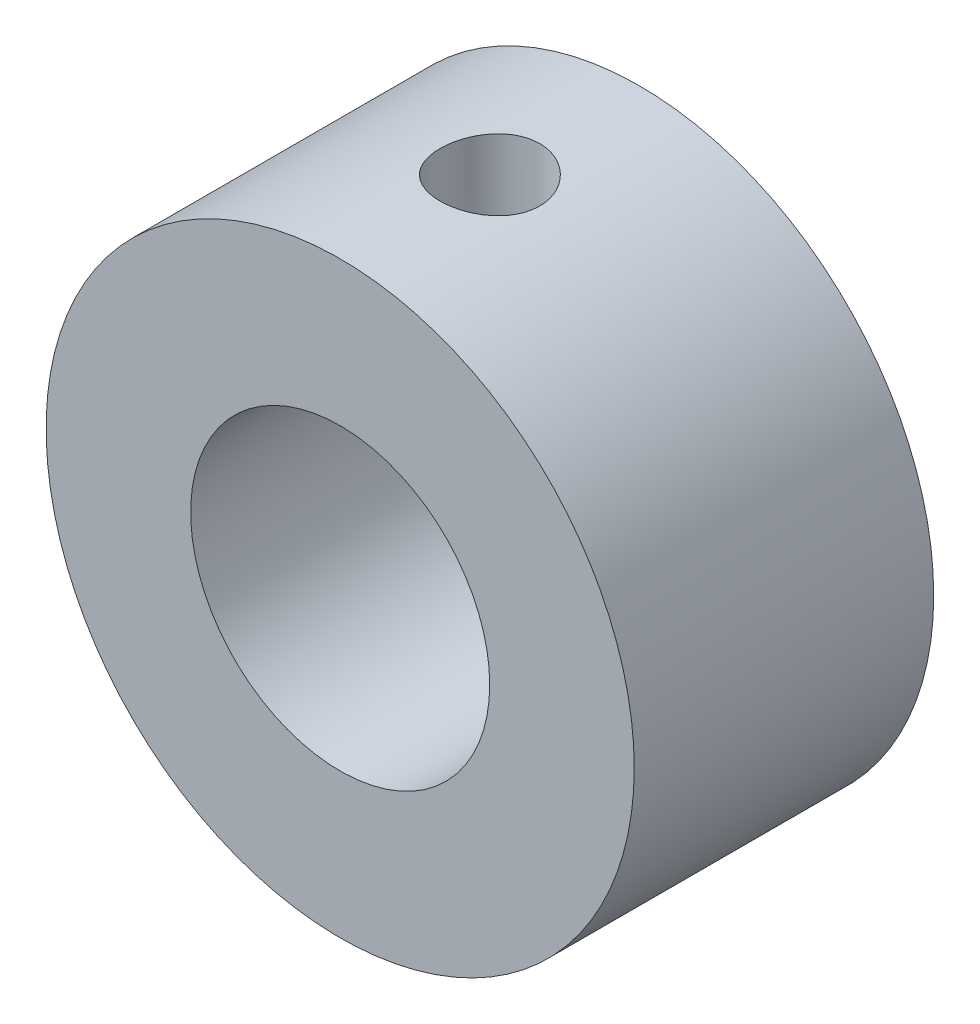
ISO-10303-21;
HEADER;
FILE_DESCRIPTION(('STEP AP214'),'2;1');
FILE_NAME('part.step','',(''),(''),'','','');
FILE_SCHEMA(('AUTOMOTIVE_DESIGN { 1 0 10303 214 1 1 1 1 }'));
ENDSEC;
DATA;
#1=APPLICATION_CONTEXT('core data for automotive mechanical design processes');
#2=APPLICATION_PROTOCOL_DEFINITION('international standard','automotive_design',2000,#1);
#3=PRODUCT_CONTEXT('',#1,'mechanical');
#4=PRODUCT('Part','Part','',(#3));
#5=PRODUCT_RELATED_PRODUCT_CATEGORY('part','',(#4));
#6=PRODUCT_DEFINITION_FORMATION('','',#4);
#7=PRODUCT_DEFINITION_CONTEXT('part definition',#1,'design');
#8=PRODUCT_DEFINITION('design','',#6,#7);
#9=PRODUCT_DEFINITION_SHAPE('','',#8);
#10=(LENGTH_UNIT() NAMED_UNIT(*) SI_UNIT(.MILLI.,.METRE.));
#11=(NAMED_UNIT(*) PLANE_ANGLE_UNIT() SI_UNIT($,.RADIAN.));
#12=(NAMED_UNIT(*) SI_UNIT($,.STERADIAN.) SOLID_ANGLE_UNIT());
#13=UNCERTAINTY_MEASURE_WITH_UNIT(LENGTH_MEASURE(1.E-05),#10,'distance_accuracy_value','');
#14=(GEOMETRIC_REPRESENTATION_CONTEXT(3) GLOBAL_UNCERTAINTY_ASSIGNED_CONTEXT((#13)) GLOBAL_UNIT_ASSIGNED_CONTEXT((#10,
#11,#12)) REPRESENTATION_CONTEXT('',''));
#15=CARTESIAN_POINT('',(0.,0.,0.));
#16=DIRECTION('',(0.,0.,1.));
#17=DIRECTION('',(1.,0.,0.));
#18=AXIS2_PLACEMENT_3D('',#15,#16,#17);
#19=CARTESIAN_POINT('',(0.,0.,9.5377));
#20=DIRECTION('',(0.,0.,1.));
#21=DIRECTION('',(1.,0.,0.));
#22=AXIS2_PLACEMENT_3D('',#19,#20,#21);
#23=PLANE('',#22);
#24=CARTESIAN_POINT('',(0.,0.,9.5377));
#25=DIRECTION('',(0.,0.,1.));
#26=DIRECTION('',(1.,0.,0.));
#27=AXIS2_PLACEMENT_3D('',#24,#25,#26);
#28=CIRCLE('',#27,9.36625);
#29=CARTESIAN_POINT('',(9.36625,0.,9.5377));
#30=VERTEX_POINT('',#29);
#31=EDGE_CURVE('E10',#30,#30,#28,.T.);
#32=ORIENTED_EDGE('',*,*,#31,.T.);
#33=EDGE_LOOP('',(#32));
#34=FACE_BOUND('',#33,.T.);
#35=CARTESIAN_POINT('',(0.,0.,9.5377));
#36=DIRECTION('',(0.,0.,1.));
#37=DIRECTION('',(1.,0.,0.));
#38=AXIS2_PLACEMENT_3D('',#35,#36,#37);
#39=CIRCLE('',#38,4.7625);
#40=CARTESIAN_POINT('',(4.7625,0.,9.5377));
#41=VERTEX_POINT('',#40);
#42=EDGE_CURVE('E43',#41,#41,#39,.T.);
#43=ORIENTED_EDGE('',*,*,#42,.F.);
#44=EDGE_LOOP('',(#43));
#45=FACE_BOUND('',#44,.T.);
#46=ADVANCED_FACE('F31',(#34,#45),#23,.T.);
#47=CARTESIAN_POINT('',(0.,0.,0.));
#48=DIRECTION('',(0.,0.,1.));
#49=DIRECTION('',(1.,0.,0.));
#50=AXIS2_PLACEMENT_3D('',#47,#48,#49);
#51=PLANE('',#50);
#52=CARTESIAN_POINT('',(0.,0.,0.));
#53=DIRECTION('',(0.,0.,1.));
#54=DIRECTION('',(1.,0.,0.));
#55=AXIS2_PLACEMENT_3D('',#52,#53,#54);
#56=CIRCLE('',#55,9.36625);
#57=CARTESIAN_POINT('',(9.36625,0.,0.));
#58=VERTEX_POINT('',#57);
#59=EDGE_CURVE('E36',#58,#58,#56,.T.);
#60=ORIENTED_EDGE('',*,*,#59,.F.);
#61=EDGE_LOOP('',(#60));
#62=FACE_BOUND('',#61,.T.);
#63=CARTESIAN_POINT('',(0.,0.,0.));
#64=DIRECTION('',(0.,0.,1.));
#65=DIRECTION('',(1.,0.,0.));
#66=AXIS2_PLACEMENT_3D('',#63,#64,#65);
#67=CIRCLE('',#66,4.7625);
#68=CARTESIAN_POINT('',(4.7625,0.,0.));
#69=VERTEX_POINT('',#68);
#70=EDGE_CURVE('E45',#69,#69,#67,.T.);
#71=ORIENTED_EDGE('',*,*,#70,.T.);
#72=EDGE_LOOP('',(#71));
#73=FACE_BOUND('',#72,.T.);
#74=ADVANCED_FACE('F72',(#62,#73),#51,.F.);
#75=CARTESIAN_POINT('',(0.,0.,9.5377));
#76=DIRECTION('',(0.,0.,-1.));
#77=DIRECTION('',(-1.,0.,0.));
#78=AXIS2_PLACEMENT_3D('',#75,#76,#77);
#79=CYLINDRICAL_SURFACE('',#78,9.36625);
#80=CARTESIAN_POINT('',(0.,9.36625,6.35635));
#81=CARTESIAN_POINT('',(-0.0884909974214831,9.36624846955004,6.35634647169036));
#82=CARTESIAN_POINT('',(-0.177029737218108,9.36498287637225,6.34892595845839));
#83=CARTESIAN_POINT('',(-0.351622465878907,9.36005605907036,6.31945318001698));
#84=CARTESIAN_POINT('',(-0.437674119663852,9.35639265539399,6.29738760253911));
#85=CARTESIAN_POINT('',(-0.604741547436172,9.34708097460426,6.23931132805155));
#86=CARTESIAN_POINT('',(-0.685761432080691,9.34143434345501,6.2033121925695));
#87=CARTESIAN_POINT('',(-0.840601086042369,9.32877652068879,6.11842129554092));
#88=CARTESIAN_POINT('',(-0.914421646264509,9.32176547921756,6.06953095239008));
#89=CARTESIAN_POINT('',(-1.05350593349388,9.30707822626383,5.95973213926598));
#90=CARTESIAN_POINT('',(-1.11868827338706,9.29939668388002,5.89872127681047));
#91=CARTESIAN_POINT('',(-1.23794266805256,9.28427482803162,5.76663367781208));
#92=CARTESIAN_POINT('',(-1.29201400957076,9.27683453007917,5.69555629555826));
#93=CARTESIAN_POINT('',(-1.38783928759858,9.26298593185614,5.54479211631971));
#94=CARTESIAN_POINT('',(-1.42951244410937,9.25658451806496,5.4650532879763));
#95=CARTESIAN_POINT('',(-1.49884175898458,9.24561259259053,5.29958055760212));
#96=CARTESIAN_POINT('',(-1.52649889747801,9.24104195288739,5.21384707525001));
#97=CARTESIAN_POINT('',(-1.56675404260033,9.23430222403009,5.03968249905667));
#98=CARTESIAN_POINT('',(-1.57949274728195,9.23211071156609,4.95128480938069));
#99=CARTESIAN_POINT('',(-1.58998571774718,9.23030956671741,4.77358158686066));
#100=CARTESIAN_POINT('',(-1.58774108020495,9.23069974537127,4.68427612093711));
#101=CARTESIAN_POINT('',(-1.56844561955069,9.23399743207921,4.5082986936527));
#102=CARTESIAN_POINT('',(-1.55155309842626,9.2368780248507,4.42160879697197));
#103=CARTESIAN_POINT('',(-1.50368992990545,9.2447898192796,4.25231169534592));
#104=CARTESIAN_POINT('',(-1.47271878463499,9.24982109699308,4.16970463489988));
#105=CARTESIAN_POINT('',(-1.39741776640716,9.26149631669534,4.01044559669229));
#106=CARTESIAN_POINT('',(-1.35302239317975,9.26814813407113,3.9338251899226));
#107=CARTESIAN_POINT('',(-1.25217962147372,9.28230950762865,3.78906146896678));
#108=CARTESIAN_POINT('',(-1.19573121779624,9.28981913532577,3.72091886256303));
#109=CARTESIAN_POINT('',(-1.07152340225711,9.30496812186042,3.59412894996079));
#110=CARTESIAN_POINT('',(-1.00362822264399,9.31260790938336,3.53561461629085));
#111=CARTESIAN_POINT('',(-0.85891269330832,9.3270674523025,3.43078875819017));
#112=CARTESIAN_POINT('',(-0.782092282377008,9.33388720207427,3.38447731745333));
#113=CARTESIAN_POINT('',(-0.621580150486302,9.34594844876249,3.30535879783426));
#114=CARTESIAN_POINT('',(-0.537882395024586,9.35118854038178,3.27256373393946));
#115=CARTESIAN_POINT('',(-0.366058166272639,9.35948883148617,3.22153371941921));
#116=CARTESIAN_POINT('',(-0.277932076996307,9.36254921964161,3.20329750859499));
#117=CARTESIAN_POINT('',(-0.10089858441314,9.36611984051139,3.18208374109493));
#118=CARTESIAN_POINT('',(-0.012013643520767,9.3666605719819,3.17892368641178));
#119=CARTESIAN_POINT('',(0.165015487231373,9.36521457937075,3.18746500186488));
#120=CARTESIAN_POINT('',(0.253159706461059,9.36322795598028,3.19916577993755));
#121=CARTESIAN_POINT('',(0.425639645423483,9.3569693697803,3.23694483164948));
#122=CARTESIAN_POINT('',(0.509995779595066,9.3527118144496,3.26293249650938));
#123=CARTESIAN_POINT('',(0.673153898693636,9.34238682372133,3.32845084723947));
#124=CARTESIAN_POINT('',(0.751955562614192,9.33631928382616,3.36798231506671));
#125=CARTESIAN_POINT('',(0.902558779104717,9.32297167660007,3.45988227748379));
#126=CARTESIAN_POINT('',(0.974290010979699,9.3156810654265,3.51236445061356));
#127=CARTESIAN_POINT('',(1.10799244725645,9.30072718155617,3.62852000281428));
#128=CARTESIAN_POINT('',(1.16996291627242,9.29306388083747,3.69219422434154));
#129=CARTESIAN_POINT('',(1.2830633990676,9.27812936842508,3.82974592429383));
#130=CARTESIAN_POINT('',(1.33406994320563,9.27086324690911,3.90372556480525));
#131=CARTESIAN_POINT('',(1.42293163583428,9.25764178049699,4.05931025092285));
#132=CARTESIAN_POINT('',(1.46078721141289,9.25168639303603,4.14091504878684));
#133=CARTESIAN_POINT('',(1.52208895312731,9.24179910854891,4.30909246752782));
#134=CARTESIAN_POINT('',(1.54559594641239,9.23785868131671,4.39564239225647));
#135=CARTESIAN_POINT('',(1.57772420678864,9.23242630540507,4.57153484667861));
#136=CARTESIAN_POINT('',(1.58634681672321,9.23093413584862,4.6608771237104));
#137=CARTESIAN_POINT('',(1.58842312114543,9.23057696479199,4.83858478605453));
#138=CARTESIAN_POINT('',(1.58207121091793,9.23167829495475,4.92694789238011));
#139=CARTESIAN_POINT('',(1.55479980622309,9.23631013064765,5.10132852554514));
#140=CARTESIAN_POINT('',(1.53388036368398,9.23984062751864,5.18734606074462));
#141=CARTESIAN_POINT('',(1.47814318764892,9.24892002303674,5.3545148505409));
#142=CARTESIAN_POINT('',(1.4433427510401,9.25446640895556,5.43567201735126));
#143=CARTESIAN_POINT('',(1.36085156419781,9.26695498632996,5.59102739249287));
#144=CARTESIAN_POINT('',(1.31316013889955,9.2738972508789,5.66522523610979));
#145=CARTESIAN_POINT('',(1.20554928535721,9.2885018215285,5.80553684196612));
#146=CARTESIAN_POINT('',(1.14548703419664,9.29617191564106,5.87154027281586));
#147=CARTESIAN_POINT('',(1.01514026195973,9.31130631041167,5.99259792477846));
#148=CARTESIAN_POINT('',(0.944853387199194,9.31877056321363,6.04764961790015));
#149=CARTESIAN_POINT('',(0.795453083395663,9.3327143603176,6.14560283332671));
#150=CARTESIAN_POINT('',(0.716280005033481,9.33918646384039,6.18841444798783));
#151=CARTESIAN_POINT('',(0.55178751704769,9.35034432389305,6.26006376129365));
#152=CARTESIAN_POINT('',(0.4664742806844,9.35503184560044,6.28891527594182));
#153=CARTESIAN_POINT('',(0.317366198972285,9.36107806268329,6.32561485370358));
#154=CARTESIAN_POINT('',(0.25446972903183,9.36300709776808,6.33712191772079));
#155=CARTESIAN_POINT('',(0.127723786082683,9.36559360722667,6.35249069480691));
#156=CARTESIAN_POINT('',(0.0638743304116691,9.36625110470522,6.35635254679484));
#157=CARTESIAN_POINT('',(0.,9.36625,6.35635));
#158=B_SPLINE_CURVE_WITH_KNOTS('',3,(#80,#81,#82,#83,#84,#85,#86,#87,#88,#89,#90,#91,#92,#93,
#94,#95,#96,#97,#98,#99,#100,#101,#102,#103,#104,#105,#106,#107,#108,#109,#110,#111,#112,#113,
#114,#115,#116,#117,#118,#119,#120,#121,#122,#123,#124,#125,#126,#127,#128,#129,#130,#131,#132,
#133,#134,#135,#136,#137,#138,#139,#140,#141,#142,#143,#144,#145,#146,#147,#148,#149,#150,#151,
#152,#153,#154,#155,#156,#157),.UNSPECIFIED.,.T.,.F.,(4,2,2,2,2,2,2,2,2,2,2,2,2,2,2,2,2,2,2,2,2,
2,2,2,2,2,2,2,2,2,2,2,2,2,2,2,2,2,4),(0.,0.265239498723961,0.530720429242939,0.795981544572953,
1.06121348588422,1.32878943090847,1.59638254721277,1.86568278443894,2.13496418711353,
2.40168496409577,2.66838621922692,2.93224061499821,3.19610434239784,3.46127689292857,
3.72647156696845,3.99506705995733,4.26366439506853,4.53249997961498,4.80131229151645,
5.06686220911071,5.33240154738497,5.59627591944241,5.86016552896331,6.12645947829093,
6.39277348088844,6.6619453985293,6.93110857378425,7.19912262888295,7.46711250295188,
7.73164259725717,7.99617174860883,8.26037229900192,8.5245866875154,8.79204215991148,
9.05955929763941,9.32899372222389,9.59816094529783,9.78961887582268,9.98107332738712),.UNSPECIFIED.);
#159=CARTESIAN_POINT('',(0.,9.36625,6.35635));
#160=VERTEX_POINT('',#159);
#161=EDGE_CURVE('E48',#160,#160,#158,.T.);
#162=ORIENTED_EDGE('',*,*,#161,.T.);
#163=EDGE_LOOP('',(#162));
#164=FACE_BOUND('',#163,.T.);
#165=ORIENTED_EDGE('',*,*,#31,.F.);
#166=EDGE_LOOP('',(#165));
#167=FACE_BOUND('',#166,.T.);
#168=ORIENTED_EDGE('',*,*,#59,.T.);
#169=EDGE_LOOP('',(#168));
#170=FACE_BOUND('',#169,.T.);
#171=ADVANCED_FACE('F33',(#164,#167,#170),#79,.T.);
#172=CARTESIAN_POINT('',(0.,0.,9.5377));
#173=DIRECTION('',(0.,0.,-1.));
#174=DIRECTION('',(-1.,0.,0.));
#175=AXIS2_PLACEMENT_3D('',#172,#173,#174);
#176=CYLINDRICAL_SURFACE('',#175,4.7625);
#177=CARTESIAN_POINT('',(0.,4.7625,6.35635));
#178=CARTESIAN_POINT('',(0.086619338582673,4.76250024290249,6.35635040279898));
#179=CARTESIAN_POINT('',(0.173236246329948,4.76011509093227,6.34923757752304));
#180=CARTESIAN_POINT('',(0.343918795385843,4.75083521197708,6.32106128975267));
#181=CARTESIAN_POINT('',(0.427984170888623,4.74394001683417,6.29999637898109));
#182=CARTESIAN_POINT('',(0.59107830333407,4.72638926301478,6.24471820112782));
#183=CARTESIAN_POINT('',(0.670115223594079,4.7157399927273,6.21052691334591));
#184=CARTESIAN_POINT('',(0.821332712178453,4.6917680757628,6.13006588811912));
#185=CARTESIAN_POINT('',(0.893511924171946,4.67844490185098,6.08379376805837));
#186=CARTESIAN_POINT('',(1.03146490909785,4.65001124928271,5.97880153478673));
#187=CARTESIAN_POINT('',(1.09696837422357,4.63485795886258,5.91973791561147));
#188=CARTESIAN_POINT('',(1.21734689966456,4.60470749718205,5.79156964190333));
#189=CARTESIAN_POINT('',(1.27221961946452,4.58971036098747,5.72246278205099));
#190=CARTESIAN_POINT('',(1.37132209578673,4.56109915307672,5.57373612962562));
#191=CARTESIAN_POINT('',(1.41520046242589,4.54753724850155,5.49387118817526));
#192=CARTESIAN_POINT('',(1.48878746228088,4.52398297352029,5.32737045004706));
#193=CARTESIAN_POINT('',(1.51850041960149,4.51398951405184,5.24073672900414));
#194=CARTESIAN_POINT('',(1.5618991201458,4.49915443940136,5.06623126087397));
#195=CARTESIAN_POINT('',(1.57609134913143,4.49415052034258,4.97849968152361));
#196=CARTESIAN_POINT('',(1.58962903329348,4.48938104899343,4.80176879027754));
#197=CARTESIAN_POINT('',(1.58897907629749,4.48961387798584,4.71276987862416));
#198=CARTESIAN_POINT('',(1.57324409712918,4.49514936325486,4.54035059917012));
#199=CARTESIAN_POINT('',(1.5588200871526,4.50021985189709,4.45686116036606));
#200=CARTESIAN_POINT('',(1.51702478352345,4.51447944137725,4.29356294637415));
#201=CARTESIAN_POINT('',(1.48965193971459,4.52366903532271,4.21375461312183));
#202=CARTESIAN_POINT('',(1.42230325467058,4.54529683920858,4.05858226002353));
#203=CARTESIAN_POINT('',(1.38213155232278,4.55778498196574,3.98331050956713));
#204=CARTESIAN_POINT('',(1.29046145625623,4.58458186738966,3.84036743310593));
#205=CARTESIAN_POINT('',(1.23895979087786,4.59889113542361,3.77269831099326));
#206=CARTESIAN_POINT('',(1.12291706563305,4.62863135053789,3.64316708791977));
#207=CARTESIAN_POINT('',(1.05783562574614,4.64408185600813,3.58179259746685));
#208=CARTESIAN_POINT('',(0.918114067327475,4.67371014689421,3.47070161417186));
#209=CARTESIAN_POINT('',(0.843473033111542,4.68788781016682,3.42098623941386));
#210=CARTESIAN_POINT('',(0.685716835710949,4.71355908851247,3.33423212337683));
#211=CARTESIAN_POINT('',(0.602524951310934,4.72502468137762,3.29732403249659));
#212=CARTESIAN_POINT('',(0.430639669841155,4.7437765034179,3.23817746134531));
#213=CARTESIAN_POINT('',(0.341948195570988,4.75106418427121,3.21593388526529));
#214=CARTESIAN_POINT('',(0.165709329377769,4.76039857975912,3.1876116301895));
#215=CARTESIAN_POINT('',(0.0782789897854426,4.76265877911043,3.18087405293826));
#216=CARTESIAN_POINT('',(-0.0964804235618777,4.76232383028039,3.18187811933757));
#217=CARTESIAN_POINT('',(-0.183809511919946,4.75972950165738,3.18961731896805));
#218=CARTESIAN_POINT('',(-0.353250287758007,4.75011789238403,3.21883390353083));
#219=CARTESIAN_POINT('',(-0.435439830850315,4.74323090454018,3.23990685210357));
#220=CARTESIAN_POINT('',(-0.595083834245074,4.72585806842736,3.29468709309093));
#221=CARTESIAN_POINT('',(-0.672537689257414,4.71537176124097,3.32839599665511));
#222=CARTESIAN_POINT('',(-0.822782670524322,4.69152178418573,3.40847431054725));
#223=CARTESIAN_POINT('',(-0.895397560257221,4.6780896842481,3.45515341683703));
#224=CARTESIAN_POINT('',(-1.03197791784024,4.64987090592067,3.55948321314641));
#225=CARTESIAN_POINT('',(-1.09594073387548,4.63508381455201,3.61713725395043));
#226=CARTESIAN_POINT('',(-1.2164258561425,4.60496996168956,3.74487876722296));
#227=CARTESIAN_POINT('',(-1.27247803867766,4.58964920726292,3.81541214774639));
#228=CARTESIAN_POINT('',(-1.37200881668868,4.5608870760535,3.96521236389978));
#229=CARTESIAN_POINT('',(-1.41548730734048,4.54744571493929,4.0444792723316));
#230=CARTESIAN_POINT('',(-1.48843512703597,4.52409546968821,4.20953091177271));
#231=CARTESIAN_POINT('',(-1.51793278481197,4.51417945258854,4.29530205068042));
#232=CARTESIAN_POINT('',(-1.56193278348048,4.49914696286489,4.47100110694506));
#233=CARTESIAN_POINT('',(-1.57644187973938,4.49402832815028,4.5609271325794));
#234=CARTESIAN_POINT('',(-1.58952609843278,4.48941600962756,4.73741288996496));
#235=CARTESIAN_POINT('',(-1.58888153347708,4.48964685408647,4.82390821520533));
#236=CARTESIAN_POINT('',(-1.5735971408498,4.49502640845389,4.99548955643878));
#237=CARTESIAN_POINT('',(-1.5589581461405,4.50017482566362,5.0805756560037));
#238=CARTESIAN_POINT('',(-1.51665275334284,4.51460432334015,5.24531536501642));
#239=CARTESIAN_POINT('',(-1.48923906179963,4.52380505610683,5.32504145969464));
#240=CARTESIAN_POINT('',(-1.4223672431436,4.54527283124319,5.4788235085145));
#241=CARTESIAN_POINT('',(-1.38290644257917,4.55754055411887,5.55287819951096));
#242=CARTESIAN_POINT('',(-1.29105134947619,4.58442741396348,5.69671782600262));
#243=CARTESIAN_POINT('',(-1.23816783538877,4.59912579731893,5.76617544676369));
#244=CARTESIAN_POINT('',(-1.12179557697784,4.62888578099664,5.89548257874742));
#245=CARTESIAN_POINT('',(-1.05830383406673,4.64394748298391,5.95532936390482));
#246=CARTESIAN_POINT('',(-0.919545971611592,4.67344173459301,6.06606675450907));
#247=CARTESIAN_POINT('',(-0.843917402680819,4.68782688609495,6.11651740205471));
#248=CARTESIAN_POINT('',(-0.684779804883017,4.71370010986522,6.2039348058004));
#249=CARTESIAN_POINT('',(-0.601272797535103,4.72518892253839,6.24090500915124));
#250=CARTESIAN_POINT('',(-0.432583664931549,4.7435375517131,6.29875809157577));
#251=CARTESIAN_POINT('',(-0.347643065311299,4.75058124720755,6.32028591519311));
#252=CARTESIAN_POINT('',(-0.175133660416267,4.76006171214452,6.34907969557494));
#253=CARTESIAN_POINT('',(-0.0875655880903848,4.76249975444399,6.35634959280075));
#254=CARTESIAN_POINT('',(0.,4.7625,6.35635));
#255=B_SPLINE_CURVE_WITH_KNOTS('',3,(#177,#178,#179,#180,#181,#182,#183,#184,#185,#186,#187,
#188,#189,#190,#191,#192,#193,#194,#195,#196,#197,#198,#199,#200,#201,#202,#203,#204,#205,#206,
#207,#208,#209,#210,#211,#212,#213,#214,#215,#216,#217,#218,#219,#220,#221,#222,#223,#224,#225,
#226,#227,#228,#229,#230,#231,#232,#233,#234,#235,#236,#237,#238,#239,#240,#241,#242,#243,#244,
#245,#246,#247,#248,#249,#250,#251,#252,#253,#254),.UNSPECIFIED.,.T.,.F.,(4,2,2,2,2,2,2,2,2,2,2,
2,2,2,2,2,2,2,2,2,2,2,2,2,2,2,2,2,2,2,2,2,2,2,2,2,2,2,4),(0.,0.259535780816292,
0.519098506612189,0.77822849318156,1.03740962475607,1.30468186298875,1.57201287843954,
1.84703060907259,2.12196433449873,2.38763057115171,2.65321468955133,2.90666212150157,
3.16013990233078,3.4176997170877,3.67533400311154,3.94641872975545,4.21752944222007,
4.49132968969943,4.76503474342568,5.02687563290582,5.2886723214813,5.54288575790414,
5.79713161888515,6.05806509751932,6.31907837054752,6.59195123823194,6.86482638073057,
7.13714621949998,7.40934326970521,7.6675561987701,7.92575375970308,8.17904744490163,
8.43239738104364,8.6968023087324,8.96128210158999,9.23606961575722,9.51078681329524,
9.77323036418429,10.0356013733555),.UNSPECIFIED.);
#256=CARTESIAN_POINT('',(0.,4.7625,6.35635));
#257=VERTEX_POINT('',#256);
#258=EDGE_CURVE('E56',#257,#257,#255,.T.);
#259=ORIENTED_EDGE('',*,*,#258,.T.);
#260=EDGE_LOOP('',(#259));
#261=FACE_BOUND('',#260,.T.);
#262=ORIENTED_EDGE('',*,*,#42,.T.);
#263=EDGE_LOOP('',(#262));
#264=FACE_BOUND('',#263,.T.);
#265=ORIENTED_EDGE('',*,*,#70,.F.);
#266=EDGE_LOOP('',(#265));
#267=FACE_BOUND('',#266,.T.);
#268=ADVANCED_FACE('F64',(#261,#264,#267),#176,.F.);
#269=CARTESIAN_POINT('',(0.,-9.36725,4.76885));
#270=DIRECTION('',(0.,1.,0.));
#271=DIRECTION('',(0.,0.,1.));
#272=AXIS2_PLACEMENT_3D('',#269,#270,#271);
#273=CYLINDRICAL_SURFACE('',#272,1.5875);
#274=ORIENTED_EDGE('',*,*,#258,.F.);
#275=EDGE_LOOP('',(#274));
#276=FACE_BOUND('',#275,.T.);
#277=ORIENTED_EDGE('',*,*,#161,.F.);
#278=EDGE_LOOP('',(#277));
#279=FACE_BOUND('',#278,.T.);
#280=ADVANCED_FACE('F60',(#276,#279),#273,.F.);
#281=CLOSED_SHELL('',(#46,#74,#171,#268,#280));
#282=MANIFOLD_SOLID_BREP('B2',#281);
#283=ADVANCED_BREP_SHAPE_REPRESENTATION('',(#18,#282),#14);
#284=SHAPE_DEFINITION_REPRESENTATION(#9,#283);
ENDSEC;
END-ISO-10303-21;
